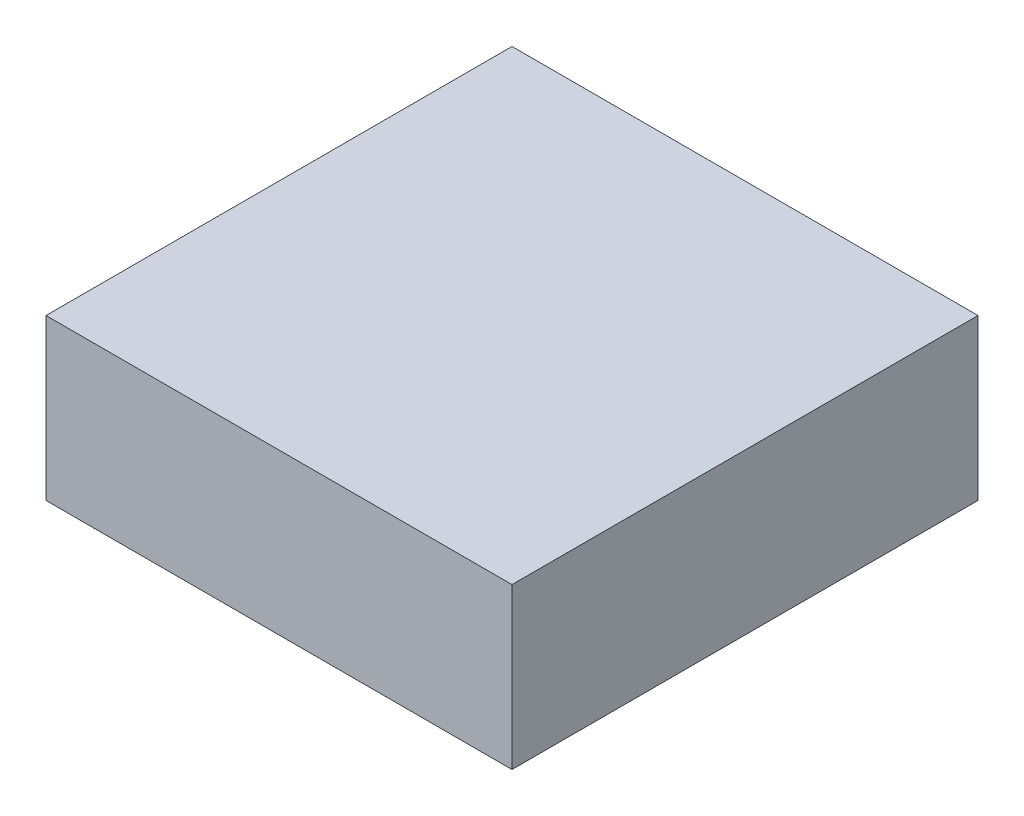
ISO-10303-21;
HEADER;
FILE_DESCRIPTION(('STEP AP214'),'2;1');
FILE_NAME('part.step','',(''),(''),'','','');
FILE_SCHEMA(('AUTOMOTIVE_DESIGN { 1 0 10303 214 1 1 1 1 }'));
ENDSEC;
DATA;
#1=APPLICATION_CONTEXT('core data for automotive mechanical design processes');
#2=APPLICATION_PROTOCOL_DEFINITION('international standard','automotive_design',2000,#1);
#3=PRODUCT_CONTEXT('',#1,'mechanical');
#4=PRODUCT('Part','Part','',(#3));
#5=PRODUCT_RELATED_PRODUCT_CATEGORY('part','',(#4));
#6=PRODUCT_DEFINITION_FORMATION('','',#4);
#7=PRODUCT_DEFINITION_CONTEXT('part definition',#1,'design');
#8=PRODUCT_DEFINITION('design','',#6,#7);
#9=PRODUCT_DEFINITION_SHAPE('','',#8);
#10=(LENGTH_UNIT() NAMED_UNIT(*) SI_UNIT(.MILLI.,.METRE.));
#11=(NAMED_UNIT(*) PLANE_ANGLE_UNIT() SI_UNIT($,.RADIAN.));
#12=(NAMED_UNIT(*) SI_UNIT($,.STERADIAN.) SOLID_ANGLE_UNIT());
#13=UNCERTAINTY_MEASURE_WITH_UNIT(LENGTH_MEASURE(1.E-05),#10,'distance_accuracy_value','');
#14=(GEOMETRIC_REPRESENTATION_CONTEXT(3) GLOBAL_UNCERTAINTY_ASSIGNED_CONTEXT((#13)) GLOBAL_UNIT_ASSIGNED_CONTEXT((#10,
#11,#12)) REPRESENTATION_CONTEXT('',''));
#15=CARTESIAN_POINT('',(0.,0.,0.));
#16=DIRECTION('',(0.,0.,1.));
#17=DIRECTION('',(1.,0.,0.));
#18=AXIS2_PLACEMENT_3D('',#15,#16,#17);
#19=CARTESIAN_POINT('',(0.,0.,0.));
#20=DIRECTION('',(0.,-1.,0.));
#21=DIRECTION('',(0.,0.,-1.));
#22=AXIS2_PLACEMENT_3D('',#19,#20,#21);
#23=PLANE('',#22);
#24=DIRECTION('',(1.,0.,0.));
#25=VECTOR('',#24,1.);
#26=CARTESIAN_POINT('',(-0.8,0.,-0.8));
#27=LINE('',#26,#25);
#28=CARTESIAN_POINT('',(-0.8,0.,-0.8));
#29=VERTEX_POINT('',#28);
#30=CARTESIAN_POINT('',(0.8,0.,-0.8));
#31=VERTEX_POINT('',#30);
#32=EDGE_CURVE('E97',#29,#31,#27,.T.);
#33=ORIENTED_EDGE('',*,*,#32,.F.);
#34=DIRECTION('',(0.,0.,-1.));
#35=VECTOR('',#34,1.);
#36=CARTESIAN_POINT('',(-0.8,0.,0.8));
#37=LINE('',#36,#35);
#38=CARTESIAN_POINT('',(-0.8,0.,0.8));
#39=VERTEX_POINT('',#38);
#40=EDGE_CURVE('E28',#39,#29,#37,.T.);
#41=ORIENTED_EDGE('',*,*,#40,.F.);
#42=DIRECTION('',(-1.,0.,0.));
#43=VECTOR('',#42,1.);
#44=CARTESIAN_POINT('',(0.8,0.,0.8));
#45=LINE('',#44,#43);
#46=CARTESIAN_POINT('',(0.8,0.,0.8));
#47=VERTEX_POINT('',#46);
#48=EDGE_CURVE('E73',#47,#39,#45,.T.);
#49=ORIENTED_EDGE('',*,*,#48,.F.);
#50=DIRECTION('',(0.,0.,1.));
#51=VECTOR('',#50,1.);
#52=CARTESIAN_POINT('',(0.8,0.,-0.8));
#53=LINE('',#52,#51);
#54=EDGE_CURVE('E87',#31,#47,#53,.T.);
#55=ORIENTED_EDGE('',*,*,#54,.F.);
#56=EDGE_LOOP('',(#33,#41,#49,#55));
#57=FACE_BOUND('',#56,.T.);
#58=ADVANCED_FACE('F17',(#57),#23,.F.);
#59=CARTESIAN_POINT('',(0.,-0.55,0.));
#60=DIRECTION('',(0.,-1.,0.));
#61=DIRECTION('',(0.,0.,-1.));
#62=AXIS2_PLACEMENT_3D('',#59,#60,#61);
#63=PLANE('',#62);
#64=DIRECTION('',(1.,0.,0.));
#65=VECTOR('',#64,1.);
#66=CARTESIAN_POINT('',(-0.8,-0.55,-0.8));
#67=LINE('',#66,#65);
#68=CARTESIAN_POINT('',(-0.8,-0.55,-0.8));
#69=VERTEX_POINT('',#68);
#70=CARTESIAN_POINT('',(0.8,-0.55,-0.8));
#71=VERTEX_POINT('',#70);
#72=EDGE_CURVE('E80',#69,#71,#67,.T.);
#73=ORIENTED_EDGE('',*,*,#72,.T.);
#74=DIRECTION('',(0.,0.,1.));
#75=VECTOR('',#74,1.);
#76=CARTESIAN_POINT('',(0.8,-0.55,-0.8));
#77=LINE('',#76,#75);
#78=CARTESIAN_POINT('',(0.8,-0.55,0.8));
#79=VERTEX_POINT('',#78);
#80=EDGE_CURVE('E103',#71,#79,#77,.T.);
#81=ORIENTED_EDGE('',*,*,#80,.T.);
#82=DIRECTION('',(-1.,0.,0.));
#83=VECTOR('',#82,1.);
#84=CARTESIAN_POINT('',(0.8,-0.55,0.8));
#85=LINE('',#84,#83);
#86=CARTESIAN_POINT('',(-0.8,-0.55,0.8));
#87=VERTEX_POINT('',#86);
#88=EDGE_CURVE('E66',#79,#87,#85,.T.);
#89=ORIENTED_EDGE('',*,*,#88,.T.);
#90=DIRECTION('',(0.,0.,-1.));
#91=VECTOR('',#90,1.);
#92=CARTESIAN_POINT('',(-0.8,-0.55,0.8));
#93=LINE('',#92,#91);
#94=EDGE_CURVE('E11',#87,#69,#93,.T.);
#95=ORIENTED_EDGE('',*,*,#94,.T.);
#96=EDGE_LOOP('',(#73,#81,#89,#95));
#97=FACE_BOUND('',#96,.T.);
#98=ADVANCED_FACE('F78',(#97),#63,.T.);
#99=CARTESIAN_POINT('',(-0.8,-0.55,0.8));
#100=DIRECTION('',(1.,0.,0.));
#101=DIRECTION('',(0.,1.,0.));
#102=AXIS2_PLACEMENT_3D('',#99,#100,#101);
#103=PLANE('',#102);
#104=ORIENTED_EDGE('',*,*,#40,.T.);
#105=DIRECTION('',(0.,1.,0.));
#106=VECTOR('',#105,1.);
#107=CARTESIAN_POINT('',(-0.8,-0.55,-0.8));
#108=LINE('',#107,#106);
#109=EDGE_CURVE('E21',#69,#29,#108,.T.);
#110=ORIENTED_EDGE('',*,*,#109,.F.);
#111=ORIENTED_EDGE('',*,*,#94,.F.);
#112=DIRECTION('',(0.,1.,0.));
#113=VECTOR('',#112,1.);
#114=CARTESIAN_POINT('',(-0.8,-0.55,0.8));
#115=LINE('',#114,#113);
#116=EDGE_CURVE('E105',#87,#39,#115,.T.);
#117=ORIENTED_EDGE('',*,*,#116,.T.);
#118=EDGE_LOOP('',(#104,#110,#111,#117));
#119=FACE_BOUND('',#118,.T.);
#120=ADVANCED_FACE('F19',(#119),#103,.F.);
#121=CARTESIAN_POINT('',(0.8,-0.55,0.8));
#122=DIRECTION('',(0.,0.,-1.));
#123=DIRECTION('',(0.,-1.,0.));
#124=AXIS2_PLACEMENT_3D('',#121,#122,#123);
#125=PLANE('',#124);
#126=ORIENTED_EDGE('',*,*,#48,.T.);
#127=ORIENTED_EDGE('',*,*,#116,.F.);
#128=ORIENTED_EDGE('',*,*,#88,.F.);
#129=DIRECTION('',(0.,1.,0.));
#130=VECTOR('',#129,1.);
#131=CARTESIAN_POINT('',(0.8,-0.55,0.8));
#132=LINE('',#131,#130);
#133=EDGE_CURVE('E101',#79,#47,#132,.T.);
#134=ORIENTED_EDGE('',*,*,#133,.T.);
#135=EDGE_LOOP('',(#126,#127,#128,#134));
#136=FACE_BOUND('',#135,.T.);
#137=ADVANCED_FACE('F126',(#136),#125,.F.);
#138=CARTESIAN_POINT('',(0.8,-0.55,-0.8));
#139=DIRECTION('',(-1.,0.,0.));
#140=DIRECTION('',(0.,0.,1.));
#141=AXIS2_PLACEMENT_3D('',#138,#139,#140);
#142=PLANE('',#141);
#143=ORIENTED_EDGE('',*,*,#54,.T.);
#144=ORIENTED_EDGE('',*,*,#133,.F.);
#145=ORIENTED_EDGE('',*,*,#80,.F.);
#146=DIRECTION('',(0.,1.,0.));
#147=VECTOR('',#146,1.);
#148=CARTESIAN_POINT('',(0.8,-0.55,-0.8));
#149=LINE('',#148,#147);
#150=EDGE_CURVE('E90',#71,#31,#149,.T.);
#151=ORIENTED_EDGE('',*,*,#150,.T.);
#152=EDGE_LOOP('',(#143,#144,#145,#151));
#153=FACE_BOUND('',#152,.T.);
#154=ADVANCED_FACE('F125',(#153),#142,.F.);
#155=CARTESIAN_POINT('',(-0.8,-0.55,-0.8));
#156=DIRECTION('',(0.,0.,1.));
#157=DIRECTION('',(1.,0.,0.));
#158=AXIS2_PLACEMENT_3D('',#155,#156,#157);
#159=PLANE('',#158);
#160=ORIENTED_EDGE('',*,*,#32,.T.);
#161=ORIENTED_EDGE('',*,*,#150,.F.);
#162=ORIENTED_EDGE('',*,*,#72,.F.);
#163=ORIENTED_EDGE('',*,*,#109,.T.);
#164=EDGE_LOOP('',(#160,#161,#162,#163));
#165=FACE_BOUND('',#164,.T.);
#166=ADVANCED_FACE('F88',(#165),#159,.F.);
#167=CLOSED_SHELL('',(#58,#98,#120,#137,#154,#166));
#168=MANIFOLD_SOLID_BREP('B1',#167);
#169=ADVANCED_BREP_SHAPE_REPRESENTATION('',(#18,#168),#14);
#170=SHAPE_DEFINITION_REPRESENTATION(#9,#169);
ENDSEC;
END-ISO-10303-21;
